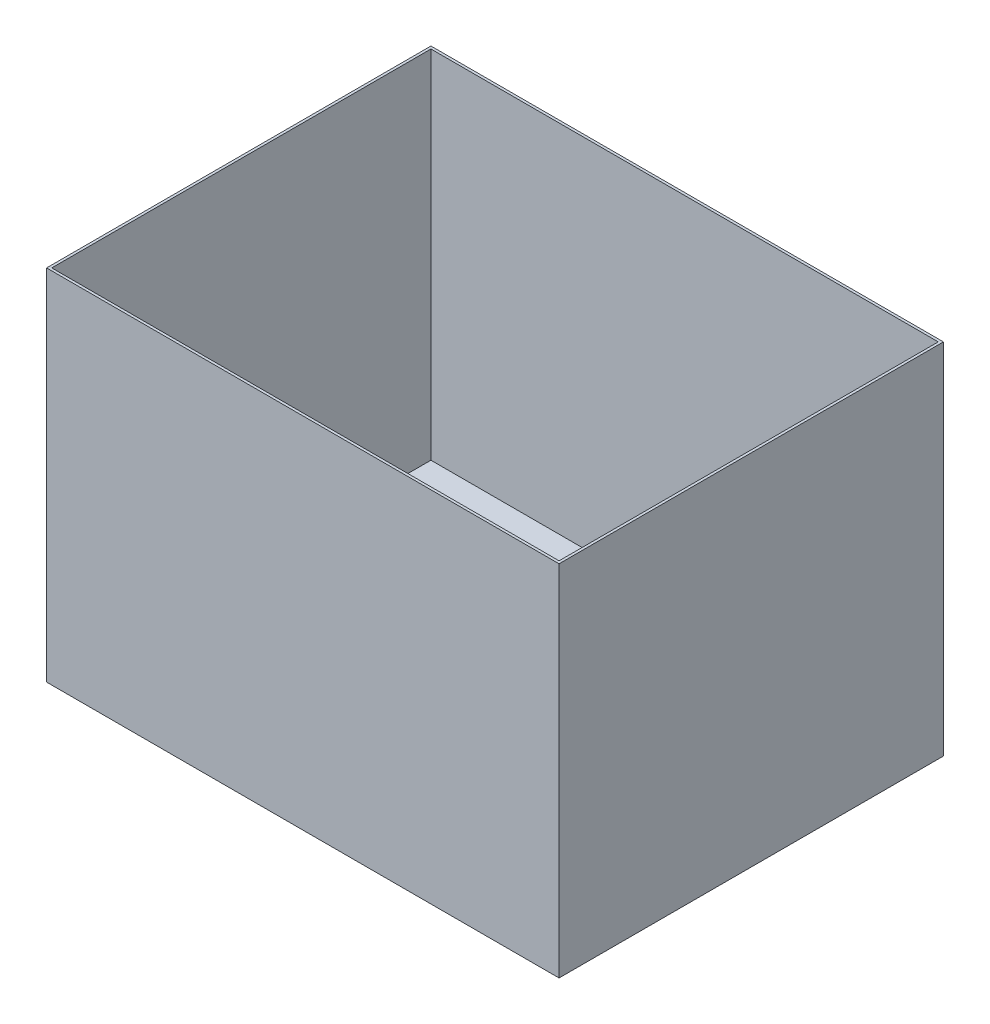
ISO-10303-21;
HEADER;
FILE_DESCRIPTION(('STEP AP214'),'2;1');
FILE_NAME('part.step','',(''),(''),'','','');
FILE_SCHEMA(('AUTOMOTIVE_DESIGN { 1 0 10303 214 1 1 1 1 }'));
ENDSEC;
DATA;
#1=APPLICATION_CONTEXT('core data for automotive mechanical design processes');
#2=APPLICATION_PROTOCOL_DEFINITION('international standard','automotive_design',2000,#1);
#3=PRODUCT_CONTEXT('',#1,'mechanical');
#4=PRODUCT('Part','Part','',(#3));
#5=PRODUCT_RELATED_PRODUCT_CATEGORY('part','',(#4));
#6=PRODUCT_DEFINITION_FORMATION('','',#4);
#7=PRODUCT_DEFINITION_CONTEXT('part definition',#1,'design');
#8=PRODUCT_DEFINITION('design','',#6,#7);
#9=PRODUCT_DEFINITION_SHAPE('','',#8);
#10=(LENGTH_UNIT() NAMED_UNIT(*) SI_UNIT(.MILLI.,.METRE.));
#11=(NAMED_UNIT(*) PLANE_ANGLE_UNIT() SI_UNIT($,.RADIAN.));
#12=(NAMED_UNIT(*) SI_UNIT($,.STERADIAN.) SOLID_ANGLE_UNIT());
#13=UNCERTAINTY_MEASURE_WITH_UNIT(LENGTH_MEASURE(1.E-05),#10,'distance_accuracy_value','');
#14=(GEOMETRIC_REPRESENTATION_CONTEXT(3) GLOBAL_UNCERTAINTY_ASSIGNED_CONTEXT((#13)) GLOBAL_UNIT_ASSIGNED_CONTEXT((#10,
#11,#12)) REPRESENTATION_CONTEXT('',''));
#15=CARTESIAN_POINT('',(0.,0.,0.));
#16=DIRECTION('',(0.,0.,1.));
#17=DIRECTION('',(1.,0.,0.));
#18=AXIS2_PLACEMENT_3D('',#15,#16,#17);
#19=CARTESIAN_POINT('',(-200.,2.,150.));
#20=DIRECTION('',(0.,0.,-1.));
#21=DIRECTION('',(-1.,0.,0.));
#22=AXIS2_PLACEMENT_3D('',#19,#20,#21);
#23=PLANE('',#22);
#24=DIRECTION('',(1.,0.,0.));
#25=VECTOR('',#24,1.);
#26=CARTESIAN_POINT('',(-200.,0.,150.));
#27=LINE('',#26,#25);
#28=CARTESIAN_POINT('',(-200.,0.,150.));
#29=VERTEX_POINT('',#28);
#30=CARTESIAN_POINT('',(200.,0.,150.));
#31=VERTEX_POINT('',#30);
#32=EDGE_CURVE('E171',#29,#31,#27,.T.);
#33=ORIENTED_EDGE('',*,*,#32,.T.);
#34=DIRECTION('',(0.,-1.,0.));
#35=VECTOR('',#34,1.);
#36=CARTESIAN_POINT('',(200.,2.,150.));
#37=LINE('',#36,#35);
#38=CARTESIAN_POINT('',(200.,280.,150.));
#39=VERTEX_POINT('',#38);
#40=EDGE_CURVE('E12',#39,#31,#37,.T.);
#41=ORIENTED_EDGE('',*,*,#40,.F.);
#42=DIRECTION('',(1.,0.,0.));
#43=VECTOR('',#42,1.);
#44=CARTESIAN_POINT('',(-200.,280.,150.));
#45=LINE('',#44,#43);
#46=CARTESIAN_POINT('',(-200.,280.,150.));
#47=VERTEX_POINT('',#46);
#48=EDGE_CURVE('E155',#47,#39,#45,.T.);
#49=ORIENTED_EDGE('',*,*,#48,.F.);
#50=DIRECTION('',(0.,-1.,0.));
#51=VECTOR('',#50,1.);
#52=CARTESIAN_POINT('',(-200.,2.,150.));
#53=LINE('',#52,#51);
#54=EDGE_CURVE('E183',#47,#29,#53,.T.);
#55=ORIENTED_EDGE('',*,*,#54,.T.);
#56=EDGE_LOOP('',(#33,#41,#49,#55));
#57=FACE_BOUND('',#56,.T.);
#58=ADVANCED_FACE('F58',(#57),#23,.F.);
#59=CARTESIAN_POINT('',(200.,2.,150.));
#60=DIRECTION('',(-1.,0.,0.));
#61=DIRECTION('',(0.,0.,1.));
#62=AXIS2_PLACEMENT_3D('',#59,#60,#61);
#63=PLANE('',#62);
#64=DIRECTION('',(0.,0.,-1.));
#65=VECTOR('',#64,1.);
#66=CARTESIAN_POINT('',(200.,0.,150.));
#67=LINE('',#66,#65);
#68=CARTESIAN_POINT('',(200.,0.,-150.));
#69=VERTEX_POINT('',#68);
#70=EDGE_CURVE('E174',#31,#69,#67,.T.);
#71=ORIENTED_EDGE('',*,*,#70,.T.);
#72=DIRECTION('',(0.,-1.,0.));
#73=VECTOR('',#72,1.);
#74=CARTESIAN_POINT('',(200.,2.,-150.));
#75=LINE('',#74,#73);
#76=CARTESIAN_POINT('',(200.,280.,-150.));
#77=VERTEX_POINT('',#76);
#78=EDGE_CURVE('E65',#77,#69,#75,.T.);
#79=ORIENTED_EDGE('',*,*,#78,.F.);
#80=DIRECTION('',(0.,0.,-1.));
#81=VECTOR('',#80,1.);
#82=CARTESIAN_POINT('',(200.,280.,150.));
#83=LINE('',#82,#81);
#84=EDGE_CURVE('E158',#39,#77,#83,.T.);
#85=ORIENTED_EDGE('',*,*,#84,.F.);
#86=ORIENTED_EDGE('',*,*,#40,.T.);
#87=EDGE_LOOP('',(#71,#79,#85,#86));
#88=FACE_BOUND('',#87,.T.);
#89=ADVANCED_FACE('F192',(#88),#63,.F.);
#90=CARTESIAN_POINT('',(-200.,2.,-150.));
#91=DIRECTION('',(0.,0.,-1.));
#92=DIRECTION('',(-1.,0.,0.));
#93=AXIS2_PLACEMENT_3D('',#90,#91,#92);
#94=PLANE('',#93);
#95=DIRECTION('',(1.,0.,0.));
#96=VECTOR('',#95,1.);
#97=CARTESIAN_POINT('',(-200.,0.,-150.));
#98=LINE('',#97,#96);
#99=CARTESIAN_POINT('',(-200.,0.,-150.));
#100=VERTEX_POINT('',#99);
#101=EDGE_CURVE('E177',#100,#69,#98,.T.);
#102=ORIENTED_EDGE('',*,*,#101,.F.);
#103=DIRECTION('',(0.,-1.,0.));
#104=VECTOR('',#103,1.);
#105=CARTESIAN_POINT('',(-200.,2.,-150.));
#106=LINE('',#105,#104);
#107=CARTESIAN_POINT('',(-200.,280.,-150.));
#108=VERTEX_POINT('',#107);
#109=EDGE_CURVE('E185',#108,#100,#106,.T.);
#110=ORIENTED_EDGE('',*,*,#109,.F.);
#111=DIRECTION('',(-1.,0.,0.));
#112=VECTOR('',#111,1.);
#113=CARTESIAN_POINT('',(-200.,280.,-150.));
#114=LINE('',#113,#112);
#115=EDGE_CURVE('E161',#77,#108,#114,.T.);
#116=ORIENTED_EDGE('',*,*,#115,.F.);
#117=ORIENTED_EDGE('',*,*,#78,.T.);
#118=EDGE_LOOP('',(#102,#110,#116,#117));
#119=FACE_BOUND('',#118,.T.);
#120=ADVANCED_FACE('F189',(#119),#94,.T.);
#121=CARTESIAN_POINT('',(-200.,2.,150.));
#122=DIRECTION('',(-1.,0.,0.));
#123=DIRECTION('',(0.,0.,1.));
#124=AXIS2_PLACEMENT_3D('',#121,#122,#123);
#125=PLANE('',#124);
#126=DIRECTION('',(0.,0.,-1.));
#127=VECTOR('',#126,1.);
#128=CARTESIAN_POINT('',(-200.,0.,150.));
#129=LINE('',#128,#127);
#130=EDGE_CURVE('E180',#29,#100,#129,.T.);
#131=ORIENTED_EDGE('',*,*,#130,.F.);
#132=ORIENTED_EDGE('',*,*,#54,.F.);
#133=DIRECTION('',(0.,0.,1.));
#134=VECTOR('',#133,1.);
#135=CARTESIAN_POINT('',(-200.,280.,150.));
#136=LINE('',#135,#134);
#137=EDGE_CURVE('E136',#108,#47,#136,.T.);
#138=ORIENTED_EDGE('',*,*,#137,.F.);
#139=ORIENTED_EDGE('',*,*,#109,.T.);
#140=EDGE_LOOP('',(#131,#132,#138,#139));
#141=FACE_BOUND('',#140,.T.);
#142=ADVANCED_FACE('F198',(#141),#125,.T.);
#143=CARTESIAN_POINT('',(0.,0.,0.));
#144=DIRECTION('',(0.,1.,0.));
#145=DIRECTION('',(0.,0.,1.));
#146=AXIS2_PLACEMENT_3D('',#143,#144,#145);
#147=PLANE('',#146);
#148=ORIENTED_EDGE('',*,*,#32,.F.);
#149=ORIENTED_EDGE('',*,*,#130,.T.);
#150=ORIENTED_EDGE('',*,*,#101,.T.);
#151=ORIENTED_EDGE('',*,*,#70,.F.);
#152=EDGE_LOOP('',(#148,#149,#150,#151));
#153=FACE_BOUND('',#152,.T.);
#154=ADVANCED_FACE('F195',(#153),#147,.F.);
#155=CARTESIAN_POINT('',(0.,280.,0.));
#156=DIRECTION('',(0.,1.,0.));
#157=DIRECTION('',(0.,0.,1.));
#158=AXIS2_PLACEMENT_3D('',#155,#156,#157);
#159=PLANE('',#158);
#160=ORIENTED_EDGE('',*,*,#137,.T.);
#161=ORIENTED_EDGE('',*,*,#48,.T.);
#162=ORIENTED_EDGE('',*,*,#84,.T.);
#163=ORIENTED_EDGE('',*,*,#115,.T.);
#164=EDGE_LOOP('',(#160,#161,#162,#163));
#165=FACE_BOUND('',#164,.T.);
#166=DIRECTION('',(1.,0.,0.));
#167=VECTOR('',#166,1.);
#168=CARTESIAN_POINT('',(0.,280.,148.));
#169=LINE('',#168,#167);
#170=CARTESIAN_POINT('',(-198.,280.,148.));
#171=VERTEX_POINT('',#170);
#172=CARTESIAN_POINT('',(198.,280.,148.));
#173=VERTEX_POINT('',#172);
#174=EDGE_CURVE('E130',#171,#173,#169,.T.);
#175=ORIENTED_EDGE('',*,*,#174,.F.);
#176=DIRECTION('',(0.,0.,1.));
#177=VECTOR('',#176,1.);
#178=CARTESIAN_POINT('',(-198.,280.,0.));
#179=LINE('',#178,#177);
#180=CARTESIAN_POINT('',(-198.,280.,-148.));
#181=VERTEX_POINT('',#180);
#182=EDGE_CURVE('E121',#181,#171,#179,.T.);
#183=ORIENTED_EDGE('',*,*,#182,.F.);
#184=DIRECTION('',(-1.,0.,0.));
#185=VECTOR('',#184,1.);
#186=CARTESIAN_POINT('',(0.,280.,-148.));
#187=LINE('',#186,#185);
#188=CARTESIAN_POINT('',(198.,280.,-148.));
#189=VERTEX_POINT('',#188);
#190=EDGE_CURVE('E144',#189,#181,#187,.T.);
#191=ORIENTED_EDGE('',*,*,#190,.F.);
#192=DIRECTION('',(0.,0.,-1.));
#193=VECTOR('',#192,1.);
#194=CARTESIAN_POINT('',(198.,280.,0.));
#195=LINE('',#194,#193);
#196=EDGE_CURVE('E142',#173,#189,#195,.T.);
#197=ORIENTED_EDGE('',*,*,#196,.F.);
#198=EDGE_LOOP('',(#175,#183,#191,#197));
#199=FACE_BOUND('',#198,.T.);
#200=ADVANCED_FACE('F140',(#165,#199),#159,.T.);
#201=CARTESIAN_POINT('',(-198.,280.,0.));
#202=DIRECTION('',(1.,0.,0.));
#203=DIRECTION('',(0.,0.,-1.));
#204=AXIS2_PLACEMENT_3D('',#201,#202,#203);
#205=PLANE('',#204);
#206=DIRECTION('',(0.,-1.,0.));
#207=VECTOR('',#206,1.);
#208=CARTESIAN_POINT('',(-198.,280.,148.));
#209=LINE('',#208,#207);
#210=CARTESIAN_POINT('',(-198.,2.,148.));
#211=VERTEX_POINT('',#210);
#212=EDGE_CURVE('E124',#171,#211,#209,.T.);
#213=ORIENTED_EDGE('',*,*,#212,.T.);
#214=DIRECTION('',(0.,0.,-1.));
#215=VECTOR('',#214,1.);
#216=CARTESIAN_POINT('',(-198.,2.,0.));
#217=LINE('',#216,#215);
#218=CARTESIAN_POINT('',(-198.,2.,-148.));
#219=VERTEX_POINT('',#218);
#220=EDGE_CURVE('E72',#211,#219,#217,.T.);
#221=ORIENTED_EDGE('',*,*,#220,.T.);
#222=DIRECTION('',(0.,-1.,0.));
#223=VECTOR('',#222,1.);
#224=CARTESIAN_POINT('',(-198.,280.,-148.));
#225=LINE('',#224,#223);
#226=EDGE_CURVE('E126',#181,#219,#225,.T.);
#227=ORIENTED_EDGE('',*,*,#226,.F.);
#228=ORIENTED_EDGE('',*,*,#182,.T.);
#229=EDGE_LOOP('',(#213,#221,#227,#228));
#230=FACE_BOUND('',#229,.T.);
#231=ADVANCED_FACE('F123',(#230),#205,.T.);
#232=CARTESIAN_POINT('',(0.,280.,148.));
#233=DIRECTION('',(0.,0.,-1.));
#234=DIRECTION('',(-1.,0.,0.));
#235=AXIS2_PLACEMENT_3D('',#232,#233,#234);
#236=PLANE('',#235);
#237=DIRECTION('',(0.,-1.,0.));
#238=VECTOR('',#237,1.);
#239=CARTESIAN_POINT('',(198.,280.,148.));
#240=LINE('',#239,#238);
#241=CARTESIAN_POINT('',(198.,2.,148.));
#242=VERTEX_POINT('',#241);
#243=EDGE_CURVE('E137',#173,#242,#240,.T.);
#244=ORIENTED_EDGE('',*,*,#243,.T.);
#245=DIRECTION('',(-1.,0.,0.));
#246=VECTOR('',#245,1.);
#247=CARTESIAN_POINT('',(0.,2.,148.));
#248=LINE('',#247,#246);
#249=EDGE_CURVE('E76',#242,#211,#248,.T.);
#250=ORIENTED_EDGE('',*,*,#249,.T.);
#251=ORIENTED_EDGE('',*,*,#212,.F.);
#252=ORIENTED_EDGE('',*,*,#174,.T.);
#253=EDGE_LOOP('',(#244,#250,#251,#252));
#254=FACE_BOUND('',#253,.T.);
#255=ADVANCED_FACE('F134',(#254),#236,.T.);
#256=CARTESIAN_POINT('',(198.,280.,0.));
#257=DIRECTION('',(-1.,0.,0.));
#258=DIRECTION('',(0.,0.,1.));
#259=AXIS2_PLACEMENT_3D('',#256,#257,#258);
#260=PLANE('',#259);
#261=DIRECTION('',(0.,-1.,0.));
#262=VECTOR('',#261,1.);
#263=CARTESIAN_POINT('',(198.,280.,-148.));
#264=LINE('',#263,#262);
#265=CARTESIAN_POINT('',(198.,2.,-148.));
#266=VERTEX_POINT('',#265);
#267=EDGE_CURVE('E149',#189,#266,#264,.T.);
#268=ORIENTED_EDGE('',*,*,#267,.T.);
#269=DIRECTION('',(0.,0.,1.));
#270=VECTOR('',#269,1.);
#271=CARTESIAN_POINT('',(198.,2.,0.));
#272=LINE('',#271,#270);
#273=EDGE_CURVE('E167',#266,#242,#272,.T.);
#274=ORIENTED_EDGE('',*,*,#273,.T.);
#275=ORIENTED_EDGE('',*,*,#243,.F.);
#276=ORIENTED_EDGE('',*,*,#196,.T.);
#277=EDGE_LOOP('',(#268,#274,#275,#276));
#278=FACE_BOUND('',#277,.T.);
#279=ADVANCED_FACE('F226',(#278),#260,.T.);
#280=CARTESIAN_POINT('',(0.,280.,-148.));
#281=DIRECTION('',(0.,0.,1.));
#282=DIRECTION('',(1.,0.,0.));
#283=AXIS2_PLACEMENT_3D('',#280,#281,#282);
#284=PLANE('',#283);
#285=ORIENTED_EDGE('',*,*,#226,.T.);
#286=DIRECTION('',(1.,0.,0.));
#287=VECTOR('',#286,1.);
#288=CARTESIAN_POINT('',(0.,2.,-148.));
#289=LINE('',#288,#287);
#290=EDGE_CURVE('E164',#219,#266,#289,.T.);
#291=ORIENTED_EDGE('',*,*,#290,.T.);
#292=ORIENTED_EDGE('',*,*,#267,.F.);
#293=ORIENTED_EDGE('',*,*,#190,.T.);
#294=EDGE_LOOP('',(#285,#291,#292,#293));
#295=FACE_BOUND('',#294,.T.);
#296=ADVANCED_FACE('F219',(#295),#284,.T.);
#297=CARTESIAN_POINT('',(0.,2.,0.));
#298=DIRECTION('',(0.,1.,0.));
#299=DIRECTION('',(0.,0.,1.));
#300=AXIS2_PLACEMENT_3D('',#297,#298,#299);
#301=PLANE('',#300);
#302=ORIENTED_EDGE('',*,*,#220,.F.);
#303=ORIENTED_EDGE('',*,*,#249,.F.);
#304=ORIENTED_EDGE('',*,*,#273,.F.);
#305=ORIENTED_EDGE('',*,*,#290,.F.);
#306=EDGE_LOOP('',(#302,#303,#304,#305));
#307=FACE_BOUND('',#306,.T.);
#308=ADVANCED_FACE('F216',(#307),#301,.T.);
#309=CLOSED_SHELL('',(#58,#89,#120,#142,#154,#200,#231,#255,#279,#296,#308));
#310=MANIFOLD_SOLID_BREP('B2',#309);
#311=ADVANCED_BREP_SHAPE_REPRESENTATION('',(#18,#310),#14);
#312=SHAPE_DEFINITION_REPRESENTATION(#9,#311);
ENDSEC;
END-ISO-10303-21;
